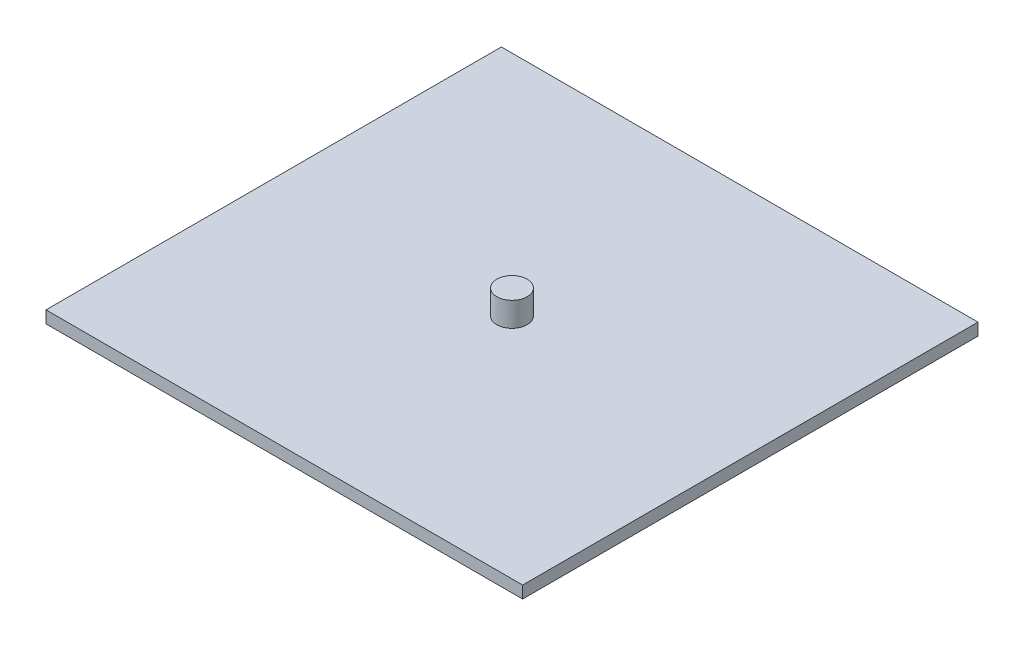
ISO-10303-21;
HEADER;
FILE_DESCRIPTION(('STEP AP214'),'2;1');
FILE_NAME('part.step','',(''),(''),'','','');
FILE_SCHEMA(('AUTOMOTIVE_DESIGN { 1 0 10303 214 1 1 1 1 }'));
ENDSEC;
DATA;
#1=APPLICATION_CONTEXT('core data for automotive mechanical design processes');
#2=APPLICATION_PROTOCOL_DEFINITION('international standard','automotive_design',2000,#1);
#3=PRODUCT_CONTEXT('',#1,'mechanical');
#4=PRODUCT('Part','Part','',(#3));
#5=PRODUCT_RELATED_PRODUCT_CATEGORY('part','',(#4));
#6=PRODUCT_DEFINITION_FORMATION('','',#4);
#7=PRODUCT_DEFINITION_CONTEXT('part definition',#1,'design');
#8=PRODUCT_DEFINITION('design','',#6,#7);
#9=PRODUCT_DEFINITION_SHAPE('','',#8);
#10=(LENGTH_UNIT() NAMED_UNIT(*) SI_UNIT(.MILLI.,.METRE.));
#11=(NAMED_UNIT(*) PLANE_ANGLE_UNIT() SI_UNIT($,.RADIAN.));
#12=(NAMED_UNIT(*) SI_UNIT($,.STERADIAN.) SOLID_ANGLE_UNIT());
#13=UNCERTAINTY_MEASURE_WITH_UNIT(LENGTH_MEASURE(1.E-05),#10,'distance_accuracy_value','');
#14=(GEOMETRIC_REPRESENTATION_CONTEXT(3) GLOBAL_UNCERTAINTY_ASSIGNED_CONTEXT((#13)) GLOBAL_UNIT_ASSIGNED_CONTEXT((#10,
#11,#12)) REPRESENTATION_CONTEXT('',''));
#15=CARTESIAN_POINT('',(0.,0.,0.));
#16=DIRECTION('',(0.,0.,1.));
#17=DIRECTION('',(1.,0.,0.));
#18=AXIS2_PLACEMENT_3D('',#15,#16,#17);
#19=CARTESIAN_POINT('',(39.25,2.,37.5));
#20=DIRECTION('',(-1.,0.,0.));
#21=DIRECTION('',(0.,0.,1.));
#22=AXIS2_PLACEMENT_3D('',#19,#20,#21);
#23=PLANE('',#22);
#24=DIRECTION('',(0.,0.,-1.));
#25=VECTOR('',#24,1.);
#26=CARTESIAN_POINT('',(39.25,0.,37.5));
#27=LINE('',#26,#25);
#28=CARTESIAN_POINT('',(39.25,0.,37.5));
#29=VERTEX_POINT('',#28);
#30=CARTESIAN_POINT('',(39.25,0.,-37.5));
#31=VERTEX_POINT('',#30);
#32=EDGE_CURVE('E99',#29,#31,#27,.T.);
#33=ORIENTED_EDGE('',*,*,#32,.T.);
#34=DIRECTION('',(0.,-1.,0.));
#35=VECTOR('',#34,1.);
#36=CARTESIAN_POINT('',(39.25,2.,-37.5));
#37=LINE('',#36,#35);
#38=CARTESIAN_POINT('',(39.25,2.,-37.5));
#39=VERTEX_POINT('',#38);
#40=EDGE_CURVE('E41',#39,#31,#37,.T.);
#41=ORIENTED_EDGE('',*,*,#40,.F.);
#42=DIRECTION('',(0.,0.,-1.));
#43=VECTOR('',#42,1.);
#44=CARTESIAN_POINT('',(39.25,2.,37.5));
#45=LINE('',#44,#43);
#46=CARTESIAN_POINT('',(39.25,2.,37.5));
#47=VERTEX_POINT('',#46);
#48=EDGE_CURVE('E85',#47,#39,#45,.T.);
#49=ORIENTED_EDGE('',*,*,#48,.F.);
#50=DIRECTION('',(0.,-1.,0.));
#51=VECTOR('',#50,1.);
#52=CARTESIAN_POINT('',(39.25,2.,37.5));
#53=LINE('',#52,#51);
#54=EDGE_CURVE('E95',#47,#29,#53,.T.);
#55=ORIENTED_EDGE('',*,*,#54,.T.);
#56=EDGE_LOOP('',(#33,#41,#49,#55));
#57=FACE_BOUND('',#56,.T.);
#58=ADVANCED_FACE('F33',(#57),#23,.F.);
#59=CARTESIAN_POINT('',(-39.25,2.,-37.5));
#60=DIRECTION('',(0.,0.,1.));
#61=DIRECTION('',(1.,0.,0.));
#62=AXIS2_PLACEMENT_3D('',#59,#60,#61);
#63=PLANE('',#62);
#64=DIRECTION('',(-1.,0.,0.));
#65=VECTOR('',#64,1.);
#66=CARTESIAN_POINT('',(-39.25,0.,-37.5));
#67=LINE('',#66,#65);
#68=CARTESIAN_POINT('',(-39.25,0.,-37.5));
#69=VERTEX_POINT('',#68);
#70=EDGE_CURVE('E90',#31,#69,#67,.T.);
#71=ORIENTED_EDGE('',*,*,#70,.T.);
#72=DIRECTION('',(0.,-1.,0.));
#73=VECTOR('',#72,1.);
#74=CARTESIAN_POINT('',(-39.25,2.,-37.5));
#75=LINE('',#74,#73);
#76=CARTESIAN_POINT('',(-39.25,2.,-37.5));
#77=VERTEX_POINT('',#76);
#78=EDGE_CURVE('E88',#77,#69,#75,.T.);
#79=ORIENTED_EDGE('',*,*,#78,.F.);
#80=DIRECTION('',(-1.,0.,0.));
#81=VECTOR('',#80,1.);
#82=CARTESIAN_POINT('',(-39.25,2.,-37.5));
#83=LINE('',#82,#81);
#84=EDGE_CURVE('E80',#39,#77,#83,.T.);
#85=ORIENTED_EDGE('',*,*,#84,.F.);
#86=ORIENTED_EDGE('',*,*,#40,.T.);
#87=EDGE_LOOP('',(#71,#79,#85,#86));
#88=FACE_BOUND('',#87,.T.);
#89=ADVANCED_FACE('F89',(#88),#63,.F.);
#90=CARTESIAN_POINT('',(-39.25,2.,37.5));
#91=DIRECTION('',(1.,0.,0.));
#92=DIRECTION('',(0.,0.,-1.));
#93=AXIS2_PLACEMENT_3D('',#90,#91,#92);
#94=PLANE('',#93);
#95=DIRECTION('',(0.,0.,1.));
#96=VECTOR('',#95,1.);
#97=CARTESIAN_POINT('',(-39.25,0.,37.5));
#98=LINE('',#97,#96);
#99=CARTESIAN_POINT('',(-39.25,0.,37.5));
#100=VERTEX_POINT('',#99);
#101=EDGE_CURVE('E66',#69,#100,#98,.T.);
#102=ORIENTED_EDGE('',*,*,#101,.T.);
#103=DIRECTION('',(0.,-1.,0.));
#104=VECTOR('',#103,1.);
#105=CARTESIAN_POINT('',(-39.25,2.,37.5));
#106=LINE('',#105,#104);
#107=CARTESIAN_POINT('',(-39.25,2.,37.5));
#108=VERTEX_POINT('',#107);
#109=EDGE_CURVE('E91',#108,#100,#106,.T.);
#110=ORIENTED_EDGE('',*,*,#109,.F.);
#111=DIRECTION('',(0.,0.,1.));
#112=VECTOR('',#111,1.);
#113=CARTESIAN_POINT('',(-39.25,2.,37.5));
#114=LINE('',#113,#112);
#115=EDGE_CURVE('E83',#77,#108,#114,.T.);
#116=ORIENTED_EDGE('',*,*,#115,.F.);
#117=ORIENTED_EDGE('',*,*,#78,.T.);
#118=EDGE_LOOP('',(#102,#110,#116,#117));
#119=FACE_BOUND('',#118,.T.);
#120=ADVANCED_FACE('F93',(#119),#94,.F.);
#121=CARTESIAN_POINT('',(-39.25,2.,37.5));
#122=DIRECTION('',(0.,0.,-1.));
#123=DIRECTION('',(-1.,0.,0.));
#124=AXIS2_PLACEMENT_3D('',#121,#122,#123);
#125=PLANE('',#124);
#126=DIRECTION('',(1.,0.,0.));
#127=VECTOR('',#126,1.);
#128=CARTESIAN_POINT('',(-39.25,0.,37.5));
#129=LINE('',#128,#127);
#130=EDGE_CURVE('E72',#100,#29,#129,.T.);
#131=ORIENTED_EDGE('',*,*,#130,.T.);
#132=ORIENTED_EDGE('',*,*,#54,.F.);
#133=DIRECTION('',(1.,0.,0.));
#134=VECTOR('',#133,1.);
#135=CARTESIAN_POINT('',(-39.25,2.,37.5));
#136=LINE('',#135,#134);
#137=EDGE_CURVE('E49',#108,#47,#136,.T.);
#138=ORIENTED_EDGE('',*,*,#137,.F.);
#139=ORIENTED_EDGE('',*,*,#109,.T.);
#140=EDGE_LOOP('',(#131,#132,#138,#139));
#141=FACE_BOUND('',#140,.T.);
#142=ADVANCED_FACE('F121',(#141),#125,.F.);
#143=CARTESIAN_POINT('',(0.,2.,0.));
#144=DIRECTION('',(0.,-1.,0.));
#145=DIRECTION('',(0.,0.,-1.));
#146=AXIS2_PLACEMENT_3D('',#143,#144,#145);
#147=PLANE('',#146);
#148=CARTESIAN_POINT('',(0.,2.,0.));
#149=DIRECTION('',(0.,-1.,0.));
#150=DIRECTION('',(0.,0.,-1.));
#151=AXIS2_PLACEMENT_3D('',#148,#149,#150);
#152=CIRCLE('',#151,2.5);
#153=CARTESIAN_POINT('',(0.,2.,-2.5));
#154=VERTEX_POINT('',#153);
#155=EDGE_CURVE('E11',#154,#154,#152,.F.);
#156=ORIENTED_EDGE('',*,*,#155,.F.);
#157=EDGE_LOOP('',(#156));
#158=FACE_BOUND('',#157,.T.);
#159=ORIENTED_EDGE('',*,*,#48,.T.);
#160=ORIENTED_EDGE('',*,*,#84,.T.);
#161=ORIENTED_EDGE('',*,*,#115,.T.);
#162=ORIENTED_EDGE('',*,*,#137,.T.);
#163=EDGE_LOOP('',(#159,#160,#161,#162));
#164=FACE_BOUND('',#163,.T.);
#165=ADVANCED_FACE('F81',(#158,#164),#147,.F.);
#166=CARTESIAN_POINT('',(0.,0.,0.));
#167=DIRECTION('',(0.,-1.,0.));
#168=DIRECTION('',(0.,0.,-1.));
#169=AXIS2_PLACEMENT_3D('',#166,#167,#168);
#170=PLANE('',#169);
#171=ORIENTED_EDGE('',*,*,#32,.F.);
#172=ORIENTED_EDGE('',*,*,#130,.F.);
#173=ORIENTED_EDGE('',*,*,#101,.F.);
#174=ORIENTED_EDGE('',*,*,#70,.F.);
#175=EDGE_LOOP('',(#171,#172,#173,#174));
#176=FACE_BOUND('',#175,.T.);
#177=ADVANCED_FACE('F110',(#176),#170,.T.);
#178=CARTESIAN_POINT('',(0.,6.,0.));
#179=DIRECTION('',(0.,-1.,0.));
#180=DIRECTION('',(0.,0.,-1.));
#181=AXIS2_PLACEMENT_3D('',#178,#179,#180);
#182=CYLINDRICAL_SURFACE('',#181,2.5);
#183=CARTESIAN_POINT('',(0.,6.,0.));
#184=DIRECTION('',(0.,1.,0.));
#185=DIRECTION('',(0.,0.,1.));
#186=AXIS2_PLACEMENT_3D('',#183,#184,#185);
#187=CIRCLE('',#186,2.5);
#188=CARTESIAN_POINT('',(0.,6.,2.5));
#189=VERTEX_POINT('',#188);
#190=EDGE_CURVE('E102',#189,#189,#187,.T.);
#191=ORIENTED_EDGE('',*,*,#190,.F.);
#192=EDGE_LOOP('',(#191));
#193=FACE_BOUND('',#192,.T.);
#194=ORIENTED_EDGE('',*,*,#155,.T.);
#195=EDGE_LOOP('',(#194));
#196=FACE_BOUND('',#195,.T.);
#197=ADVANCED_FACE('F112',(#193,#196),#182,.T.);
#198=CARTESIAN_POINT('',(0.,6.,0.));
#199=DIRECTION('',(0.,1.,0.));
#200=DIRECTION('',(0.,0.,1.));
#201=AXIS2_PLACEMENT_3D('',#198,#199,#200);
#202=PLANE('',#201);
#203=ORIENTED_EDGE('',*,*,#190,.T.);
#204=EDGE_LOOP('',(#203));
#205=FACE_BOUND('',#204,.T.);
#206=ADVANCED_FACE('F118',(#205),#202,.T.);
#207=CLOSED_SHELL('',(#58,#89,#120,#142,#165,#177,#197,#206));
#208=MANIFOLD_SOLID_BREP('B2',#207);
#209=ADVANCED_BREP_SHAPE_REPRESENTATION('',(#18,#208),#14);
#210=SHAPE_DEFINITION_REPRESENTATION(#9,#209);
ENDSEC;
END-ISO-10303-21;
